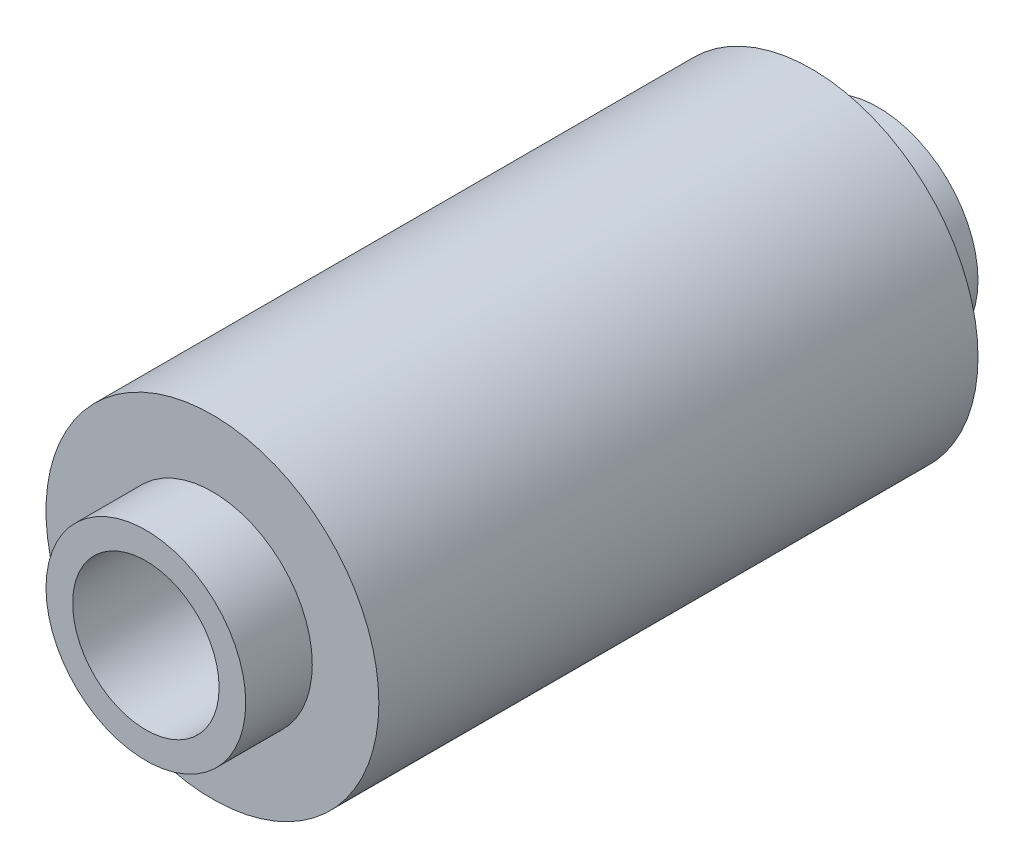
ISO-10303-21;
HEADER;
FILE_DESCRIPTION(('STEP AP214'),'2;1');
FILE_NAME('part.step','',(''),(''),'','','');
FILE_SCHEMA(('AUTOMOTIVE_DESIGN { 1 0 10303 214 1 1 1 1 }'));
ENDSEC;
DATA;
#1=APPLICATION_CONTEXT('core data for automotive mechanical design processes');
#2=APPLICATION_PROTOCOL_DEFINITION('international standard','automotive_design',2000,#1);
#3=PRODUCT_CONTEXT('',#1,'mechanical');
#4=PRODUCT('Part','Part','',(#3));
#5=PRODUCT_RELATED_PRODUCT_CATEGORY('part','',(#4));
#6=PRODUCT_DEFINITION_FORMATION('','',#4);
#7=PRODUCT_DEFINITION_CONTEXT('part definition',#1,'design');
#8=PRODUCT_DEFINITION('design','',#6,#7);
#9=PRODUCT_DEFINITION_SHAPE('','',#8);
#10=(LENGTH_UNIT() NAMED_UNIT(*) SI_UNIT(.MILLI.,.METRE.));
#11=(NAMED_UNIT(*) PLANE_ANGLE_UNIT() SI_UNIT($,.RADIAN.));
#12=(NAMED_UNIT(*) SI_UNIT($,.STERADIAN.) SOLID_ANGLE_UNIT());
#13=UNCERTAINTY_MEASURE_WITH_UNIT(LENGTH_MEASURE(1.E-05),#10,'distance_accuracy_value','');
#14=(GEOMETRIC_REPRESENTATION_CONTEXT(3) GLOBAL_UNCERTAINTY_ASSIGNED_CONTEXT((#13)) GLOBAL_UNIT_ASSIGNED_CONTEXT((#10,
#11,#12)) REPRESENTATION_CONTEXT('',''));
#15=CARTESIAN_POINT('',(0.,0.,0.));
#16=DIRECTION('',(0.,0.,1.));
#17=DIRECTION('',(1.,0.,0.));
#18=AXIS2_PLACEMENT_3D('',#15,#16,#17);
#19=CARTESIAN_POINT('',(0.,0.,9.));
#20=DIRECTION('',(0.,0.,1.));
#21=DIRECTION('',(1.,0.,0.));
#22=AXIS2_PLACEMENT_3D('',#19,#20,#21);
#23=PLANE('',#22);
#24=CARTESIAN_POINT('',(0.,0.,9.));
#25=DIRECTION('',(0.,0.,1.));
#26=DIRECTION('',(1.,0.,0.));
#27=AXIS2_PLACEMENT_3D('',#24,#25,#26);
#28=CIRCLE('',#27,1.5);
#29=CARTESIAN_POINT('',(1.5,0.,9.));
#30=VERTEX_POINT('',#29);
#31=EDGE_CURVE('E10',#30,#30,#28,.T.);
#32=ORIENTED_EDGE('',*,*,#31,.F.);
#33=EDGE_LOOP('',(#32));
#34=FACE_BOUND('',#33,.T.);
#35=CARTESIAN_POINT('',(0.,0.,9.));
#36=DIRECTION('',(0.,0.,1.));
#37=DIRECTION('',(1.,0.,0.));
#38=AXIS2_PLACEMENT_3D('',#35,#36,#37);
#39=CIRCLE('',#38,2.5);
#40=CARTESIAN_POINT('',(2.5,0.,9.));
#41=VERTEX_POINT('',#40);
#42=EDGE_CURVE('E44',#41,#41,#39,.T.);
#43=ORIENTED_EDGE('',*,*,#42,.T.);
#44=EDGE_LOOP('',(#43));
#45=FACE_BOUND('',#44,.T.);
#46=ADVANCED_FACE('F40',(#34,#45),#23,.T.);
#47=CARTESIAN_POINT('',(0.,0.,0.));
#48=DIRECTION('',(0.,0.,1.));
#49=DIRECTION('',(1.,0.,0.));
#50=AXIS2_PLACEMENT_3D('',#47,#48,#49);
#51=PLANE('',#50);
#52=CARTESIAN_POINT('',(0.,0.,0.));
#53=DIRECTION('',(0.,0.,1.));
#54=DIRECTION('',(1.,0.,0.));
#55=AXIS2_PLACEMENT_3D('',#52,#53,#54);
#56=CIRCLE('',#55,1.5);
#57=CARTESIAN_POINT('',(1.5,0.,0.));
#58=VERTEX_POINT('',#57);
#59=EDGE_CURVE('E59',#58,#58,#56,.T.);
#60=ORIENTED_EDGE('',*,*,#59,.T.);
#61=EDGE_LOOP('',(#60));
#62=FACE_BOUND('',#61,.T.);
#63=CARTESIAN_POINT('',(0.,0.,0.));
#64=DIRECTION('',(0.,0.,1.));
#65=DIRECTION('',(1.,0.,0.));
#66=AXIS2_PLACEMENT_3D('',#63,#64,#65);
#67=CIRCLE('',#66,2.5);
#68=CARTESIAN_POINT('',(2.5,0.,0.));
#69=VERTEX_POINT('',#68);
#70=EDGE_CURVE('E41',#69,#69,#67,.T.);
#71=ORIENTED_EDGE('',*,*,#70,.F.);
#72=EDGE_LOOP('',(#71));
#73=FACE_BOUND('',#72,.T.);
#74=ADVANCED_FACE('F91',(#62,#73),#51,.F.);
#75=CARTESIAN_POINT('',(0.,0.,9.));
#76=DIRECTION('',(0.,0.,-1.));
#77=DIRECTION('',(-1.,0.,0.));
#78=AXIS2_PLACEMENT_3D('',#75,#76,#77);
#79=CYLINDRICAL_SURFACE('',#78,2.5);
#80=ORIENTED_EDGE('',*,*,#42,.F.);
#81=EDGE_LOOP('',(#80));
#82=FACE_BOUND('',#81,.T.);
#83=ORIENTED_EDGE('',*,*,#70,.T.);
#84=EDGE_LOOP('',(#83));
#85=FACE_BOUND('',#84,.T.);
#86=ADVANCED_FACE('F39',(#82,#85),#79,.T.);
#87=CARTESIAN_POINT('',(0.,0.,9.));
#88=DIRECTION('',(0.,0.,-1.));
#89=DIRECTION('',(-1.,0.,0.));
#90=AXIS2_PLACEMENT_3D('',#87,#88,#89);
#91=CYLINDRICAL_SURFACE('',#90,1.1);
#92=CARTESIAN_POINT('',(0.,0.,-1.));
#93=DIRECTION('',(0.,0.,1.));
#94=DIRECTION('',(1.,0.,0.));
#95=AXIS2_PLACEMENT_3D('',#92,#93,#94);
#96=CIRCLE('',#95,1.1);
#97=CARTESIAN_POINT('',(1.1,0.,-1.));
#98=VERTEX_POINT('',#97);
#99=EDGE_CURVE('E53',#98,#98,#96,.T.);
#100=ORIENTED_EDGE('',*,*,#99,.F.);
#101=EDGE_LOOP('',(#100));
#102=FACE_BOUND('',#101,.T.);
#103=CARTESIAN_POINT('',(0.,0.,10.));
#104=DIRECTION('',(0.,0.,1.));
#105=DIRECTION('',(1.,0.,0.));
#106=AXIS2_PLACEMENT_3D('',#103,#104,#105);
#107=CIRCLE('',#106,1.1);
#108=CARTESIAN_POINT('',(1.1,0.,10.));
#109=VERTEX_POINT('',#108);
#110=EDGE_CURVE('E77',#109,#109,#107,.T.);
#111=ORIENTED_EDGE('',*,*,#110,.T.);
#112=EDGE_LOOP('',(#111));
#113=FACE_BOUND('',#112,.T.);
#114=ADVANCED_FACE('F68',(#102,#113),#91,.F.);
#115=CARTESIAN_POINT('',(0.,0.,-1.));
#116=DIRECTION('',(0.,0.,1.));
#117=DIRECTION('',(1.,0.,0.));
#118=AXIS2_PLACEMENT_3D('',#115,#116,#117);
#119=PLANE('',#118);
#120=CARTESIAN_POINT('',(0.,0.,-1.));
#121=DIRECTION('',(0.,0.,1.));
#122=DIRECTION('',(1.,0.,0.));
#123=AXIS2_PLACEMENT_3D('',#120,#121,#122);
#124=CIRCLE('',#123,1.5);
#125=CARTESIAN_POINT('',(1.5,0.,-1.));
#126=VERTEX_POINT('',#125);
#127=EDGE_CURVE('E60',#126,#126,#124,.T.);
#128=ORIENTED_EDGE('',*,*,#127,.F.);
#129=EDGE_LOOP('',(#128));
#130=FACE_BOUND('',#129,.T.);
#131=ORIENTED_EDGE('',*,*,#99,.T.);
#132=EDGE_LOOP('',(#131));
#133=FACE_BOUND('',#132,.T.);
#134=ADVANCED_FACE('F66',(#130,#133),#119,.F.);
#135=CARTESIAN_POINT('',(0.,0.,0.));
#136=DIRECTION('',(0.,0.,-1.));
#137=DIRECTION('',(-1.,0.,0.));
#138=AXIS2_PLACEMENT_3D('',#135,#136,#137);
#139=CYLINDRICAL_SURFACE('',#138,1.5);
#140=ORIENTED_EDGE('',*,*,#59,.F.);
#141=EDGE_LOOP('',(#140));
#142=FACE_BOUND('',#141,.T.);
#143=ORIENTED_EDGE('',*,*,#127,.T.);
#144=EDGE_LOOP('',(#143));
#145=FACE_BOUND('',#144,.T.);
#146=ADVANCED_FACE('F63',(#142,#145),#139,.T.);
#147=CARTESIAN_POINT('',(0.,0.,10.));
#148=DIRECTION('',(0.,0.,1.));
#149=DIRECTION('',(1.,0.,0.));
#150=AXIS2_PLACEMENT_3D('',#147,#148,#149);
#151=PLANE('',#150);
#152=CARTESIAN_POINT('',(0.,0.,10.));
#153=DIRECTION('',(0.,0.,1.));
#154=DIRECTION('',(1.,0.,0.));
#155=AXIS2_PLACEMENT_3D('',#152,#153,#154);
#156=CIRCLE('',#155,1.5);
#157=CARTESIAN_POINT('',(1.5,0.,10.));
#158=VERTEX_POINT('',#157);
#159=EDGE_CURVE('E55',#158,#158,#156,.T.);
#160=ORIENTED_EDGE('',*,*,#159,.T.);
#161=EDGE_LOOP('',(#160));
#162=FACE_BOUND('',#161,.T.);
#163=ORIENTED_EDGE('',*,*,#110,.F.);
#164=EDGE_LOOP('',(#163));
#165=FACE_BOUND('',#164,.T.);
#166=ADVANCED_FACE('F84',(#162,#165),#151,.T.);
#167=CARTESIAN_POINT('',(0.,0.,10.));
#168=DIRECTION('',(0.,0.,-1.));
#169=DIRECTION('',(-1.,0.,0.));
#170=AXIS2_PLACEMENT_3D('',#167,#168,#169);
#171=CYLINDRICAL_SURFACE('',#170,1.5);
#172=ORIENTED_EDGE('',*,*,#159,.F.);
#173=EDGE_LOOP('',(#172));
#174=FACE_BOUND('',#173,.T.);
#175=ORIENTED_EDGE('',*,*,#31,.T.);
#176=EDGE_LOOP('',(#175));
#177=FACE_BOUND('',#176,.T.);
#178=ADVANCED_FACE('F85',(#174,#177),#171,.T.);
#179=CLOSED_SHELL('',(#46,#74,#86,#114,#134,#146,#166,#178));
#180=MANIFOLD_SOLID_BREP('B2',#179);
#181=ADVANCED_BREP_SHAPE_REPRESENTATION('',(#18,#180),#14);
#182=SHAPE_DEFINITION_REPRESENTATION(#9,#181);
ENDSEC;
END-ISO-10303-21;
